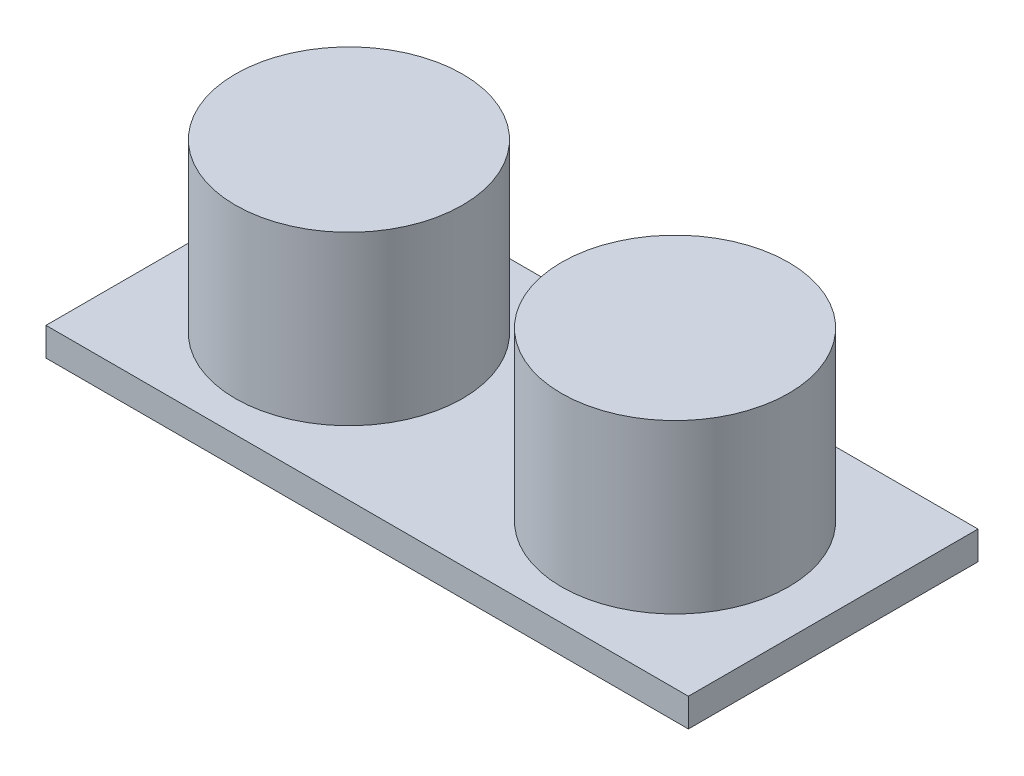
ISO-10303-21;
HEADER;
FILE_DESCRIPTION(('STEP AP214'),'2;1');
FILE_NAME('part.step','',(''),(''),'','','');
FILE_SCHEMA(('AUTOMOTIVE_DESIGN { 1 0 10303 214 1 1 1 1 }'));
ENDSEC;
DATA;
#1=APPLICATION_CONTEXT('core data for automotive mechanical design processes');
#2=APPLICATION_PROTOCOL_DEFINITION('international standard','automotive_design',2000,#1);
#3=PRODUCT_CONTEXT('',#1,'mechanical');
#4=PRODUCT('Part','Part','',(#3));
#5=PRODUCT_RELATED_PRODUCT_CATEGORY('part','',(#4));
#6=PRODUCT_DEFINITION_FORMATION('','',#4);
#7=PRODUCT_DEFINITION_CONTEXT('part definition',#1,'design');
#8=PRODUCT_DEFINITION('design','',#6,#7);
#9=PRODUCT_DEFINITION_SHAPE('','',#8);
#10=(LENGTH_UNIT() NAMED_UNIT(*) SI_UNIT(.MILLI.,.METRE.));
#11=(NAMED_UNIT(*) PLANE_ANGLE_UNIT() SI_UNIT($,.RADIAN.));
#12=(NAMED_UNIT(*) SI_UNIT($,.STERADIAN.) SOLID_ANGLE_UNIT());
#13=UNCERTAINTY_MEASURE_WITH_UNIT(LENGTH_MEASURE(1.E-05),#10,'distance_accuracy_value','');
#14=(GEOMETRIC_REPRESENTATION_CONTEXT(3) GLOBAL_UNCERTAINTY_ASSIGNED_CONTEXT((#13)) GLOBAL_UNIT_ASSIGNED_CONTEXT((#10,
#11,#12)) REPRESENTATION_CONTEXT('',''));
#15=CARTESIAN_POINT('',(0.,0.,0.));
#16=DIRECTION('',(0.,0.,1.));
#17=DIRECTION('',(1.,0.,0.));
#18=AXIS2_PLACEMENT_3D('',#15,#16,#17);
#19=CARTESIAN_POINT('',(-21.3607899807322,2.,-8.06478805394991));
#20=DIRECTION('',(0.,0.,1.));
#21=DIRECTION('',(1.,0.,0.));
#22=AXIS2_PLACEMENT_3D('',#19,#20,#21);
#23=PLANE('',#22);
#24=DIRECTION('',(1.,0.,0.));
#25=VECTOR('',#24,1.);
#26=CARTESIAN_POINT('',(6.48921001926783,-2.3,-8.06478805394991));
#27=LINE('',#26,#25);
#28=CARTESIAN_POINT('',(-3.96078998073218,-2.3,-8.06478805394991));
#29=VERTEX_POINT('',#28);
#30=CARTESIAN_POINT('',(6.48921001926783,-2.3,-8.06478805394991));
#31=VERTEX_POINT('',#30);
#32=EDGE_CURVE('E50',#29,#31,#27,.T.);
#33=ORIENTED_EDGE('',*,*,#32,.F.);
#34=DIRECTION('',(0.,1.,0.));
#35=VECTOR('',#34,1.);
#36=CARTESIAN_POINT('',(-3.96078998073218,-4.3,-8.06478805394991));
#37=LINE('',#36,#35);
#38=CARTESIAN_POINT('',(-3.96078998073218,0.,-8.06478805394991));
#39=VERTEX_POINT('',#38);
#40=EDGE_CURVE('E149',#29,#39,#37,.T.);
#41=ORIENTED_EDGE('',*,*,#40,.T.);
#42=DIRECTION('',(-1.,0.,0.));
#43=VECTOR('',#42,1.);
#44=CARTESIAN_POINT('',(-21.3607899807322,0.,-8.06478805394991));
#45=LINE('',#44,#43);
#46=CARTESIAN_POINT('',(-21.3607899807322,0.,-8.06478805394991));
#47=VERTEX_POINT('',#46);
#48=EDGE_CURVE('E204',#39,#47,#45,.T.);
#49=ORIENTED_EDGE('',*,*,#48,.T.);
#50=DIRECTION('',(0.,-1.,0.));
#51=VECTOR('',#50,1.);
#52=CARTESIAN_POINT('',(-21.3607899807322,2.,-8.06478805394991));
#53=LINE('',#52,#51);
#54=CARTESIAN_POINT('',(-21.3607899807322,2.,-8.06478805394991));
#55=VERTEX_POINT('',#54);
#56=EDGE_CURVE('E197',#55,#47,#53,.T.);
#57=ORIENTED_EDGE('',*,*,#56,.F.);
#58=DIRECTION('',(-1.,0.,0.));
#59=VECTOR('',#58,1.);
#60=CARTESIAN_POINT('',(-21.3607899807322,2.,-8.06478805394991));
#61=LINE('',#60,#59);
#62=CARTESIAN_POINT('',(23.8892100192678,2.,-8.06478805394991));
#63=VERTEX_POINT('',#62);
#64=EDGE_CURVE('E195',#63,#55,#61,.T.);
#65=ORIENTED_EDGE('',*,*,#64,.F.);
#66=DIRECTION('',(0.,-1.,0.));
#67=VECTOR('',#66,1.);
#68=CARTESIAN_POINT('',(23.8892100192678,2.,-8.06478805394991));
#69=LINE('',#68,#67);
#70=CARTESIAN_POINT('',(23.8892100192678,0.,-8.06478805394991));
#71=VERTEX_POINT('',#70);
#72=EDGE_CURVE('E214',#63,#71,#69,.T.);
#73=ORIENTED_EDGE('',*,*,#72,.T.);
#74=CARTESIAN_POINT('',(6.48921001926783,0.,-8.06478805394991));
#75=VERTEX_POINT('',#74);
#76=EDGE_CURVE('E191',#71,#75,#45,.T.);
#77=ORIENTED_EDGE('',*,*,#76,.T.);
#78=DIRECTION('',(0.,1.,0.));
#79=VECTOR('',#78,1.);
#80=CARTESIAN_POINT('',(6.48921001926783,-4.3,-8.06478805394991));
#81=LINE('',#80,#79);
#82=EDGE_CURVE('E165',#31,#75,#81,.T.);
#83=ORIENTED_EDGE('',*,*,#82,.F.);
#84=EDGE_LOOP('',(#33,#41,#49,#57,#65,#73,#77,#83));
#85=FACE_BOUND('',#84,.T.);
#86=ADVANCED_FACE('F33',(#85),#23,.F.);
#87=CARTESIAN_POINT('',(0.,2.,0.));
#88=DIRECTION('',(0.,1.,0.));
#89=DIRECTION('',(0.,0.,1.));
#90=AXIS2_PLACEMENT_3D('',#87,#88,#89);
#91=PLANE('',#90);
#92=CARTESIAN_POINT('',(-10.2220616570328,2.,2.13521194605009));
#93=DIRECTION('',(0.,1.,0.));
#94=DIRECTION('',(0.,0.,1.));
#95=AXIS2_PLACEMENT_3D('',#92,#93,#94);
#96=CIRCLE('',#95,8.);
#97=CARTESIAN_POINT('',(-10.2220616570328,2.,-5.86478805394991));
#98=VERTEX_POINT('',#97);
#99=EDGE_CURVE('E183',#98,#98,#96,.T.);
#100=ORIENTED_EDGE('',*,*,#99,.F.);
#101=EDGE_LOOP('',(#100));
#102=FACE_BOUND('',#101,.T.);
#103=DIRECTION('',(0.,0.,1.));
#104=VECTOR('',#103,1.);
#105=CARTESIAN_POINT('',(-21.3607899807322,2.,-8.06478805394991));
#106=LINE('',#105,#104);
#107=CARTESIAN_POINT('',(-21.3607899807322,2.,12.3352119460501));
#108=VERTEX_POINT('',#107);
#109=EDGE_CURVE('E187',#55,#108,#106,.T.);
#110=ORIENTED_EDGE('',*,*,#109,.T.);
#111=DIRECTION('',(1.,0.,0.));
#112=VECTOR('',#111,1.);
#113=CARTESIAN_POINT('',(-21.3607899807322,2.,12.3352119460501));
#114=LINE('',#113,#112);
#115=CARTESIAN_POINT('',(23.8892100192678,2.,12.3352119460501));
#116=VERTEX_POINT('',#115);
#117=EDGE_CURVE('E190',#108,#116,#114,.T.);
#118=ORIENTED_EDGE('',*,*,#117,.T.);
#119=DIRECTION('',(0.,0.,-1.));
#120=VECTOR('',#119,1.);
#121=CARTESIAN_POINT('',(23.8892100192678,2.,-8.06478805394991));
#122=LINE('',#121,#120);
#123=EDGE_CURVE('E193',#116,#63,#122,.T.);
#124=ORIENTED_EDGE('',*,*,#123,.T.);
#125=ORIENTED_EDGE('',*,*,#64,.T.);
#126=EDGE_LOOP('',(#110,#118,#124,#125));
#127=FACE_BOUND('',#126,.T.);
#128=CARTESIAN_POINT('',(12.7492100192678,2.,2.13521194605009));
#129=DIRECTION('',(0.,1.,0.));
#130=DIRECTION('',(0.,0.,1.));
#131=AXIS2_PLACEMENT_3D('',#128,#129,#130);
#132=CIRCLE('',#131,8.);
#133=CARTESIAN_POINT('',(12.7492100192678,2.,-5.86478805394991));
#134=VERTEX_POINT('',#133);
#135=EDGE_CURVE('E180',#134,#134,#132,.T.);
#136=ORIENTED_EDGE('',*,*,#135,.F.);
#137=EDGE_LOOP('',(#136));
#138=FACE_BOUND('',#137,.T.);
#139=ADVANCED_FACE('F232',(#102,#127,#138),#91,.T.);
#140=CARTESIAN_POINT('',(0.,0.,0.));
#141=DIRECTION('',(0.,1.,0.));
#142=DIRECTION('',(0.,0.,1.));
#143=AXIS2_PLACEMENT_3D('',#140,#141,#142);
#144=PLANE('',#143);
#145=ORIENTED_EDGE('',*,*,#48,.F.);
#146=DIRECTION('',(0.,0.,1.));
#147=VECTOR('',#146,1.);
#148=CARTESIAN_POINT('',(-3.96078998073218,0.,0.));
#149=LINE('',#148,#147);
#150=CARTESIAN_POINT('',(-3.96078998073218,0.,-5.56478805394991));
#151=VERTEX_POINT('',#150);
#152=EDGE_CURVE('E58',#39,#151,#149,.T.);
#153=ORIENTED_EDGE('',*,*,#152,.T.);
#154=DIRECTION('',(-1.,0.,0.));
#155=VECTOR('',#154,1.);
#156=CARTESIAN_POINT('',(0.,0.,-5.56478805394991));
#157=LINE('',#156,#155);
#158=CARTESIAN_POINT('',(6.48921001926783,0.,-5.56478805394991));
#159=VERTEX_POINT('',#158);
#160=EDGE_CURVE('E160',#159,#151,#157,.T.);
#161=ORIENTED_EDGE('',*,*,#160,.F.);
#162=DIRECTION('',(0.,0.,1.));
#163=VECTOR('',#162,1.);
#164=CARTESIAN_POINT('',(6.48921001926783,0.,0.));
#165=LINE('',#164,#163);
#166=EDGE_CURVE('E158',#75,#159,#165,.T.);
#167=ORIENTED_EDGE('',*,*,#166,.F.);
#168=ORIENTED_EDGE('',*,*,#76,.F.);
#169=DIRECTION('',(0.,0.,-1.));
#170=VECTOR('',#169,1.);
#171=CARTESIAN_POINT('',(23.8892100192678,0.,-8.06478805394991));
#172=LINE('',#171,#170);
#173=CARTESIAN_POINT('',(23.8892100192678,0.,12.3352119460501));
#174=VERTEX_POINT('',#173);
#175=EDGE_CURVE('E202',#174,#71,#172,.T.);
#176=ORIENTED_EDGE('',*,*,#175,.F.);
#177=DIRECTION('',(1.,0.,0.));
#178=VECTOR('',#177,1.);
#179=CARTESIAN_POINT('',(-21.3607899807322,0.,12.3352119460501));
#180=LINE('',#179,#178);
#181=CARTESIAN_POINT('',(-21.3607899807322,0.,12.3352119460501));
#182=VERTEX_POINT('',#181);
#183=EDGE_CURVE('E200',#182,#174,#180,.T.);
#184=ORIENTED_EDGE('',*,*,#183,.F.);
#185=DIRECTION('',(0.,0.,1.));
#186=VECTOR('',#185,1.);
#187=CARTESIAN_POINT('',(-21.3607899807322,0.,-8.06478805394991));
#188=LINE('',#187,#186);
#189=EDGE_CURVE('E186',#47,#182,#188,.T.);
#190=ORIENTED_EDGE('',*,*,#189,.F.);
#191=EDGE_LOOP('',(#145,#153,#161,#167,#168,#176,#184,#190));
#192=FACE_BOUND('',#191,.T.);
#193=ADVANCED_FACE('F225',(#192),#144,.F.);
#194=CARTESIAN_POINT('',(-21.3607899807322,2.,-8.06478805394991));
#195=DIRECTION('',(1.,0.,0.));
#196=DIRECTION('',(0.,0.,-1.));
#197=AXIS2_PLACEMENT_3D('',#194,#195,#196);
#198=PLANE('',#197);
#199=ORIENTED_EDGE('',*,*,#189,.T.);
#200=DIRECTION('',(0.,-1.,0.));
#201=VECTOR('',#200,1.);
#202=CARTESIAN_POINT('',(-21.3607899807322,2.,12.3352119460501));
#203=LINE('',#202,#201);
#204=EDGE_CURVE('E11',#108,#182,#203,.T.);
#205=ORIENTED_EDGE('',*,*,#204,.F.);
#206=ORIENTED_EDGE('',*,*,#109,.F.);
#207=ORIENTED_EDGE('',*,*,#56,.T.);
#208=EDGE_LOOP('',(#199,#205,#206,#207));
#209=FACE_BOUND('',#208,.T.);
#210=ADVANCED_FACE('F35',(#209),#198,.F.);
#211=CARTESIAN_POINT('',(-21.3607899807322,2.,12.3352119460501));
#212=DIRECTION('',(0.,0.,-1.));
#213=DIRECTION('',(-1.,0.,0.));
#214=AXIS2_PLACEMENT_3D('',#211,#212,#213);
#215=PLANE('',#214);
#216=ORIENTED_EDGE('',*,*,#183,.T.);
#217=DIRECTION('',(0.,-1.,0.));
#218=VECTOR('',#217,1.);
#219=CARTESIAN_POINT('',(23.8892100192678,2.,12.3352119460501));
#220=LINE('',#219,#218);
#221=EDGE_CURVE('E42',#116,#174,#220,.T.);
#222=ORIENTED_EDGE('',*,*,#221,.F.);
#223=ORIENTED_EDGE('',*,*,#117,.F.);
#224=ORIENTED_EDGE('',*,*,#204,.T.);
#225=EDGE_LOOP('',(#216,#222,#223,#224));
#226=FACE_BOUND('',#225,.T.);
#227=ADVANCED_FACE('F229',(#226),#215,.F.);
#228=CARTESIAN_POINT('',(23.8892100192678,2.,-8.06478805394991));
#229=DIRECTION('',(-1.,0.,0.));
#230=DIRECTION('',(0.,0.,1.));
#231=AXIS2_PLACEMENT_3D('',#228,#229,#230);
#232=PLANE('',#231);
#233=ORIENTED_EDGE('',*,*,#175,.T.);
#234=ORIENTED_EDGE('',*,*,#72,.F.);
#235=ORIENTED_EDGE('',*,*,#123,.F.);
#236=ORIENTED_EDGE('',*,*,#221,.T.);
#237=EDGE_LOOP('',(#233,#234,#235,#236));
#238=FACE_BOUND('',#237,.T.);
#239=ADVANCED_FACE('F243',(#238),#232,.F.);
#240=CARTESIAN_POINT('',(-10.2220616570328,13.8,2.13521194605009));
#241=DIRECTION('',(0.,-1.,0.));
#242=DIRECTION('',(0.,0.,-1.));
#243=AXIS2_PLACEMENT_3D('',#240,#241,#242);
#244=CYLINDRICAL_SURFACE('',#243,8.);
#245=CARTESIAN_POINT('',(-10.2220616570328,13.8,2.13521194605009));
#246=DIRECTION('',(0.,-1.,0.));
#247=DIRECTION('',(0.,0.,-1.));
#248=AXIS2_PLACEMENT_3D('',#245,#246,#247);
#249=CIRCLE('',#248,8.);
#250=CARTESIAN_POINT('',(-10.2220616570328,13.8,-5.86478805394991));
#251=VERTEX_POINT('',#250);
#252=EDGE_CURVE('E177',#251,#251,#249,.T.);
#253=CARTESIAN_POINT('',(-10.2220616570328,2.,-5.86478805394991));
#254=CARTESIAN_POINT('',(-10.2220616570328,2.12291666666667,-5.86478805394991));
#255=CARTESIAN_POINT('',(-10.2220616570328,2.24583333333333,-5.86478805394991));
#256=CARTESIAN_POINT('',(-10.2220616570328,2.49166666666667,-5.86478805394991));
#257=CARTESIAN_POINT('',(-10.2220616570328,2.61458333333333,-5.86478805394991));
#258=CARTESIAN_POINT('',(-10.2220616570328,2.86041666666667,-5.86478805394991));
#259=CARTESIAN_POINT('',(-10.2220616570328,2.98333333333333,-5.86478805394991));
#260=CARTESIAN_POINT('',(-10.2220616570328,3.22916666666666,-5.86478805394991));
#261=CARTESIAN_POINT('',(-10.2220616570328,3.35208333333333,-5.86478805394991));
#262=CARTESIAN_POINT('',(-10.2220616570328,3.59791666666667,-5.86478805394991));
#263=CARTESIAN_POINT('',(-10.2220616570328,3.72083333333333,-5.86478805394991));
#264=CARTESIAN_POINT('',(-10.2220616570328,3.96666666666667,-5.86478805394991));
#265=CARTESIAN_POINT('',(-10.2220616570328,4.08958333333333,-5.86478805394991));
#266=CARTESIAN_POINT('',(-10.2220616570328,4.33541666666667,-5.86478805394991));
#267=CARTESIAN_POINT('',(-10.2220616570328,4.45833333333333,-5.86478805394991));
#268=CARTESIAN_POINT('',(-10.2220616570328,4.70416666666667,-5.86478805394991));
#269=CARTESIAN_POINT('',(-10.2220616570328,4.82708333333333,-5.86478805394991));
#270=CARTESIAN_POINT('',(-10.2220616570328,5.07291666666667,-5.86478805394991));
#271=CARTESIAN_POINT('',(-10.2220616570328,5.19583333333333,-5.86478805394991));
#272=CARTESIAN_POINT('',(-10.2220616570328,5.44166666666667,-5.86478805394991));
#273=CARTESIAN_POINT('',(-10.2220616570328,5.56458333333333,-5.86478805394991));
#274=CARTESIAN_POINT('',(-10.2220616570328,5.81041666666667,-5.86478805394991));
#275=CARTESIAN_POINT('',(-10.2220616570328,5.93333333333333,-5.86478805394991));
#276=CARTESIAN_POINT('',(-10.2220616570328,6.17916666666667,-5.86478805394991));
#277=CARTESIAN_POINT('',(-10.2220616570328,6.30208333333333,-5.86478805394991));
#278=CARTESIAN_POINT('',(-10.2220616570328,6.54791666666667,-5.86478805394991));
#279=CARTESIAN_POINT('',(-10.2220616570328,6.67083333333333,-5.86478805394991));
#280=CARTESIAN_POINT('',(-10.2220616570328,6.91666666666667,-5.86478805394991));
#281=CARTESIAN_POINT('',(-10.2220616570328,7.03958333333333,-5.86478805394991));
#282=CARTESIAN_POINT('',(-10.2220616570328,7.28541666666667,-5.86478805394991));
#283=CARTESIAN_POINT('',(-10.2220616570328,7.40833333333333,-5.86478805394991));
#284=CARTESIAN_POINT('',(-10.2220616570328,7.65416666666667,-5.86478805394991));
#285=CARTESIAN_POINT('',(-10.2220616570328,7.77708333333333,-5.86478805394991));
#286=CARTESIAN_POINT('',(-10.2220616570328,8.02291666666667,-5.86478805394991));
#287=CARTESIAN_POINT('',(-10.2220616570328,8.14583333333333,-5.86478805394991));
#288=CARTESIAN_POINT('',(-10.2220616570328,8.39166666666667,-5.86478805394991));
#289=CARTESIAN_POINT('',(-10.2220616570328,8.51458333333333,-5.86478805394991));
#290=CARTESIAN_POINT('',(-10.2220616570328,8.76041666666667,-5.86478805394991));
#291=CARTESIAN_POINT('',(-10.2220616570328,8.88333333333333,-5.86478805394991));
#292=CARTESIAN_POINT('',(-10.2220616570328,9.12916666666667,-5.86478805394991));
#293=CARTESIAN_POINT('',(-10.2220616570328,9.25208333333333,-5.86478805394991));
#294=CARTESIAN_POINT('',(-10.2220616570328,9.49791666666667,-5.86478805394991));
#295=CARTESIAN_POINT('',(-10.2220616570328,9.62083333333333,-5.86478805394991));
#296=CARTESIAN_POINT('',(-10.2220616570328,9.86666666666667,-5.86478805394991));
#297=CARTESIAN_POINT('',(-10.2220616570328,9.98958333333333,-5.86478805394991));
#298=CARTESIAN_POINT('',(-10.2220616570328,10.2354166666667,-5.86478805394991));
#299=CARTESIAN_POINT('',(-10.2220616570328,10.3583333333333,-5.86478805394991));
#300=CARTESIAN_POINT('',(-10.2220616570328,10.6041666666667,-5.86478805394991));
#301=CARTESIAN_POINT('',(-10.2220616570328,10.7270833333333,-5.86478805394991));
#302=CARTESIAN_POINT('',(-10.2220616570328,10.9729166666667,-5.86478805394991));
#303=CARTESIAN_POINT('',(-10.2220616570328,11.0958333333333,-5.86478805394991));
#304=CARTESIAN_POINT('',(-10.2220616570328,11.3416666666667,-5.86478805394991));
#305=CARTESIAN_POINT('',(-10.2220616570328,11.4645833333333,-5.86478805394991));
#306=CARTESIAN_POINT('',(-10.2220616570328,11.7104166666667,-5.86478805394991));
#307=CARTESIAN_POINT('',(-10.2220616570328,11.8333333333333,-5.86478805394991));
#308=CARTESIAN_POINT('',(-10.2220616570328,12.0791666666667,-5.86478805394991));
#309=CARTESIAN_POINT('',(-10.2220616570328,12.2020833333333,-5.86478805394991));
#310=CARTESIAN_POINT('',(-10.2220616570328,12.4479166666667,-5.86478805394991));
#311=CARTESIAN_POINT('',(-10.2220616570328,12.5708333333333,-5.86478805394991));
#312=CARTESIAN_POINT('',(-10.2220616570328,12.8166666666667,-5.86478805394991));
#313=CARTESIAN_POINT('',(-10.2220616570328,12.9395833333333,-5.86478805394991));
#314=CARTESIAN_POINT('',(-10.2220616570328,13.1854166666667,-5.86478805394991));
#315=CARTESIAN_POINT('',(-10.2220616570328,13.3083333333333,-5.86478805394991));
#316=CARTESIAN_POINT('',(-10.2220616570328,13.5541666666667,-5.86478805394991));
#317=CARTESIAN_POINT('',(-10.2220616570328,13.6770833333333,-5.86478805394991));
#318=CARTESIAN_POINT('',(-10.2220616570328,13.8,-5.86478805394991));
#319=B_SPLINE_CURVE_WITH_KNOTS('',3,(#253,#254,#255,#256,#257,#258,#259,#260,#261,#262,#263,
#264,#265,#266,#267,#268,#269,#270,#271,#272,#273,#274,#275,#276,#277,#278,#279,#280,#281,#282,
#283,#284,#285,#286,#287,#288,#289,#290,#291,#292,#293,#294,#295,#296,#297,#298,#299,#300,#301,
#302,#303,#304,#305,#306,#307,#308,#309,#310,#311,#312,#313,#314,#315,#316,#317,#318),
.UNSPECIFIED.,.F.,.F.,(4,2,2,2,2,2,2,2,2,2,2,2,2,2,2,2,2,2,2,2,2,2,2,2,2,2,2,2,2,2,2,2,4),(0.,
0.368750000000001,0.7375,1.10625,1.475,1.84375,2.2125,2.58125,2.95,3.31875,3.6875,4.05625,4.425,
4.79375,5.1625,5.53125,5.9,6.26875,6.6375,7.00625,7.375,7.74375,8.1125,8.48125,8.85,9.21875,
9.5875,9.95625,10.325,10.69375,11.0625,11.43125,11.8),.UNSPECIFIED.);
#320=EDGE_CURVE('BSEAM245',#98,#251,#319,.T.);
#321=ORIENTED_EDGE('',*,*,#99,.T.);
#322=ORIENTED_EDGE('',*,*,#252,.T.);
#323=ORIENTED_EDGE('',*,*,#320,.T.);
#324=ORIENTED_EDGE('',*,*,#320,.F.);
#325=EDGE_LOOP('',(#321,#323,#322,#324));
#326=FACE_BOUND('',#325,.T.);
#327=ADVANCED_FACE('F245',(#326),#244,.T.);
#328=CARTESIAN_POINT('',(-10.2220616570328,13.8,2.13521194605009));
#329=DIRECTION('',(0.,-1.,0.));
#330=DIRECTION('',(0.,0.,-1.));
#331=AXIS2_PLACEMENT_3D('',#328,#329,#330);
#332=PLANE('',#331);
#333=ORIENTED_EDGE('',*,*,#252,.F.);
#334=EDGE_LOOP('',(#333));
#335=FACE_BOUND('',#334,.T.);
#336=ADVANCED_FACE('F287',(#335),#332,.F.);
#337=CARTESIAN_POINT('',(12.7492100192678,13.8,2.13521194605009));
#338=DIRECTION('',(0.,-1.,0.));
#339=DIRECTION('',(0.,0.,-1.));
#340=AXIS2_PLACEMENT_3D('',#337,#338,#339);
#341=CYLINDRICAL_SURFACE('',#340,8.);
#342=CARTESIAN_POINT('',(12.7492100192678,13.8,2.13521194605009));
#343=DIRECTION('',(0.,-1.,0.));
#344=DIRECTION('',(0.,0.,-1.));
#345=AXIS2_PLACEMENT_3D('',#342,#343,#344);
#346=CIRCLE('',#345,8.);
#347=CARTESIAN_POINT('',(12.7492100192678,13.8,-5.86478805394991));
#348=VERTEX_POINT('',#347);
#349=EDGE_CURVE('E174',#348,#348,#346,.T.);
#350=CARTESIAN_POINT('',(12.7492100192678,2.,-5.86478805394991));
#351=CARTESIAN_POINT('',(12.7492100192678,2.12291666666667,-5.86478805394991));
#352=CARTESIAN_POINT('',(12.7492100192678,2.24583333333333,-5.86478805394991));
#353=CARTESIAN_POINT('',(12.7492100192678,2.49166666666667,-5.86478805394991));
#354=CARTESIAN_POINT('',(12.7492100192678,2.61458333333333,-5.86478805394991));
#355=CARTESIAN_POINT('',(12.7492100192678,2.86041666666667,-5.86478805394991));
#356=CARTESIAN_POINT('',(12.7492100192678,2.98333333333333,-5.86478805394991));
#357=CARTESIAN_POINT('',(12.7492100192678,3.22916666666666,-5.86478805394991));
#358=CARTESIAN_POINT('',(12.7492100192678,3.35208333333333,-5.86478805394991));
#359=CARTESIAN_POINT('',(12.7492100192678,3.59791666666667,-5.86478805394991));
#360=CARTESIAN_POINT('',(12.7492100192678,3.72083333333333,-5.86478805394991));
#361=CARTESIAN_POINT('',(12.7492100192678,3.96666666666667,-5.86478805394991));
#362=CARTESIAN_POINT('',(12.7492100192678,4.08958333333333,-5.86478805394991));
#363=CARTESIAN_POINT('',(12.7492100192678,4.33541666666667,-5.86478805394991));
#364=CARTESIAN_POINT('',(12.7492100192678,4.45833333333333,-5.86478805394991));
#365=CARTESIAN_POINT('',(12.7492100192678,4.70416666666667,-5.86478805394991));
#366=CARTESIAN_POINT('',(12.7492100192678,4.82708333333333,-5.86478805394991));
#367=CARTESIAN_POINT('',(12.7492100192678,5.07291666666667,-5.86478805394991));
#368=CARTESIAN_POINT('',(12.7492100192678,5.19583333333333,-5.86478805394991));
#369=CARTESIAN_POINT('',(12.7492100192678,5.44166666666667,-5.86478805394991));
#370=CARTESIAN_POINT('',(12.7492100192678,5.56458333333333,-5.86478805394991));
#371=CARTESIAN_POINT('',(12.7492100192678,5.81041666666667,-5.86478805394991));
#372=CARTESIAN_POINT('',(12.7492100192678,5.93333333333333,-5.86478805394991));
#373=CARTESIAN_POINT('',(12.7492100192678,6.17916666666667,-5.86478805394991));
#374=CARTESIAN_POINT('',(12.7492100192678,6.30208333333333,-5.86478805394991));
#375=CARTESIAN_POINT('',(12.7492100192678,6.54791666666667,-5.86478805394991));
#376=CARTESIAN_POINT('',(12.7492100192678,6.67083333333333,-5.86478805394991));
#377=CARTESIAN_POINT('',(12.7492100192678,6.91666666666667,-5.86478805394991));
#378=CARTESIAN_POINT('',(12.7492100192678,7.03958333333333,-5.86478805394991));
#379=CARTESIAN_POINT('',(12.7492100192678,7.28541666666667,-5.86478805394991));
#380=CARTESIAN_POINT('',(12.7492100192678,7.40833333333333,-5.86478805394991));
#381=CARTESIAN_POINT('',(12.7492100192678,7.65416666666667,-5.86478805394991));
#382=CARTESIAN_POINT('',(12.7492100192678,7.77708333333333,-5.86478805394991));
#383=CARTESIAN_POINT('',(12.7492100192678,8.02291666666667,-5.86478805394991));
#384=CARTESIAN_POINT('',(12.7492100192678,8.14583333333333,-5.86478805394991));
#385=CARTESIAN_POINT('',(12.7492100192678,8.39166666666667,-5.86478805394991));
#386=CARTESIAN_POINT('',(12.7492100192678,8.51458333333333,-5.86478805394991));
#387=CARTESIAN_POINT('',(12.7492100192678,8.76041666666667,-5.86478805394991));
#388=CARTESIAN_POINT('',(12.7492100192678,8.88333333333333,-5.86478805394991));
#389=CARTESIAN_POINT('',(12.7492100192678,9.12916666666667,-5.86478805394991));
#390=CARTESIAN_POINT('',(12.7492100192678,9.25208333333333,-5.86478805394991));
#391=CARTESIAN_POINT('',(12.7492100192678,9.49791666666667,-5.86478805394991));
#392=CARTESIAN_POINT('',(12.7492100192678,9.62083333333333,-5.86478805394991));
#393=CARTESIAN_POINT('',(12.7492100192678,9.86666666666667,-5.86478805394991));
#394=CARTESIAN_POINT('',(12.7492100192678,9.98958333333333,-5.86478805394991));
#395=CARTESIAN_POINT('',(12.7492100192678,10.2354166666667,-5.86478805394991));
#396=CARTESIAN_POINT('',(12.7492100192678,10.3583333333333,-5.86478805394991));
#397=CARTESIAN_POINT('',(12.7492100192678,10.6041666666667,-5.86478805394991));
#398=CARTESIAN_POINT('',(12.7492100192678,10.7270833333333,-5.86478805394991));
#399=CARTESIAN_POINT('',(12.7492100192678,10.9729166666667,-5.86478805394991));
#400=CARTESIAN_POINT('',(12.7492100192678,11.0958333333333,-5.86478805394991));
#401=CARTESIAN_POINT('',(12.7492100192678,11.3416666666667,-5.86478805394991));
#402=CARTESIAN_POINT('',(12.7492100192678,11.4645833333333,-5.86478805394991));
#403=CARTESIAN_POINT('',(12.7492100192678,11.7104166666667,-5.86478805394991));
#404=CARTESIAN_POINT('',(12.7492100192678,11.8333333333333,-5.86478805394991));
#405=CARTESIAN_POINT('',(12.7492100192678,12.0791666666667,-5.86478805394991));
#406=CARTESIAN_POINT('',(12.7492100192678,12.2020833333333,-5.86478805394991));
#407=CARTESIAN_POINT('',(12.7492100192678,12.4479166666667,-5.86478805394991));
#408=CARTESIAN_POINT('',(12.7492100192678,12.5708333333333,-5.86478805394991));
#409=CARTESIAN_POINT('',(12.7492100192678,12.8166666666667,-5.86478805394991));
#410=CARTESIAN_POINT('',(12.7492100192678,12.9395833333333,-5.86478805394991));
#411=CARTESIAN_POINT('',(12.7492100192678,13.1854166666667,-5.86478805394991));
#412=CARTESIAN_POINT('',(12.7492100192678,13.3083333333333,-5.86478805394991));
#413=CARTESIAN_POINT('',(12.7492100192678,13.5541666666667,-5.86478805394991));
#414=CARTESIAN_POINT('',(12.7492100192678,13.6770833333333,-5.86478805394991));
#415=CARTESIAN_POINT('',(12.7492100192678,13.8,-5.86478805394991));
#416=B_SPLINE_CURVE_WITH_KNOTS('',3,(#350,#351,#352,#353,#354,#355,#356,#357,#358,#359,#360,
#361,#362,#363,#364,#365,#366,#367,#368,#369,#370,#371,#372,#373,#374,#375,#376,#377,#378,#379,
#380,#381,#382,#383,#384,#385,#386,#387,#388,#389,#390,#391,#392,#393,#394,#395,#396,#397,#398,
#399,#400,#401,#402,#403,#404,#405,#406,#407,#408,#409,#410,#411,#412,#413,#414,#415),
.UNSPECIFIED.,.F.,.F.,(4,2,2,2,2,2,2,2,2,2,2,2,2,2,2,2,2,2,2,2,2,2,2,2,2,2,2,2,2,2,2,2,4),(0.,
0.368750000000001,0.7375,1.10625,1.475,1.84375,2.2125,2.58125,2.95,3.31875,3.6875,4.05625,4.425,
4.79375,5.1625,5.53125,5.9,6.26875,6.6375,7.00625,7.375,7.74375,8.1125,8.48125,8.85,9.21875,
9.5875,9.95625,10.325,10.69375,11.0625,11.43125,11.8),.UNSPECIFIED.);
#417=EDGE_CURVE('BSEAM297',#134,#348,#416,.T.);
#418=ORIENTED_EDGE('',*,*,#135,.T.);
#419=ORIENTED_EDGE('',*,*,#349,.T.);
#420=ORIENTED_EDGE('',*,*,#417,.T.);
#421=ORIENTED_EDGE('',*,*,#417,.F.);
#422=EDGE_LOOP('',(#418,#420,#419,#421));
#423=FACE_BOUND('',#422,.T.);
#424=ADVANCED_FACE('F297',(#423),#341,.T.);
#425=CARTESIAN_POINT('',(12.7492100192678,13.8,2.13521194605009));
#426=DIRECTION('',(0.,-1.,0.));
#427=DIRECTION('',(0.,0.,-1.));
#428=AXIS2_PLACEMENT_3D('',#425,#426,#427);
#429=PLANE('',#428);
#430=ORIENTED_EDGE('',*,*,#349,.F.);
#431=EDGE_LOOP('',(#430));
#432=FACE_BOUND('',#431,.T.);
#433=ADVANCED_FACE('F306',(#432),#429,.F.);
#434=CARTESIAN_POINT('',(-3.96078998073218,-4.3,0.));
#435=DIRECTION('',(-1.,0.,0.));
#436=DIRECTION('',(0.,0.,1.));
#437=AXIS2_PLACEMENT_3D('',#434,#435,#436);
#438=PLANE('',#437);
#439=ORIENTED_EDGE('',*,*,#152,.F.);
#440=ORIENTED_EDGE('',*,*,#40,.F.);
#441=DIRECTION('',(0.,0.,1.));
#442=VECTOR('',#441,1.);
#443=CARTESIAN_POINT('',(-3.96078998073218,-2.3,-14.4647880539499));
#444=LINE('',#443,#442);
#445=CARTESIAN_POINT('',(-3.96078998073218,-2.3,-14.4647880539499));
#446=VERTEX_POINT('',#445);
#447=EDGE_CURVE('E153',#446,#29,#444,.T.);
#448=ORIENTED_EDGE('',*,*,#447,.F.);
#449=DIRECTION('',(0.,1.,0.));
#450=VECTOR('',#449,1.);
#451=CARTESIAN_POINT('',(-3.96078998073218,-4.3,-14.4647880539499));
#452=LINE('',#451,#450);
#453=CARTESIAN_POINT('',(-3.96078998073218,-4.3,-14.4647880539499));
#454=VERTEX_POINT('',#453);
#455=EDGE_CURVE('E133',#454,#446,#452,.T.);
#456=ORIENTED_EDGE('',*,*,#455,.F.);
#457=DIRECTION('',(0.,0.,1.));
#458=VECTOR('',#457,1.);
#459=CARTESIAN_POINT('',(-3.96078998073218,-4.3,0.));
#460=LINE('',#459,#458);
#461=CARTESIAN_POINT('',(-3.96078998073218,-4.3,-5.56478805394991));
#462=VERTEX_POINT('',#461);
#463=EDGE_CURVE('E125',#454,#462,#460,.T.);
#464=ORIENTED_EDGE('',*,*,#463,.T.);
#465=DIRECTION('',(0.,1.,0.));
#466=VECTOR('',#465,1.);
#467=CARTESIAN_POINT('',(-3.96078998073218,-4.3,-5.56478805394991));
#468=LINE('',#467,#466);
#469=EDGE_CURVE('E171',#462,#151,#468,.T.);
#470=ORIENTED_EDGE('',*,*,#469,.T.);
#471=EDGE_LOOP('',(#439,#440,#448,#456,#464,#470));
#472=FACE_BOUND('',#471,.T.);
#473=ADVANCED_FACE('F315',(#472),#438,.T.);
#474=CARTESIAN_POINT('',(6.48921001926783,-4.3,0.));
#475=DIRECTION('',(-1.,0.,0.));
#476=DIRECTION('',(0.,0.,1.));
#477=AXIS2_PLACEMENT_3D('',#474,#475,#476);
#478=PLANE('',#477);
#479=ORIENTED_EDGE('',*,*,#166,.T.);
#480=DIRECTION('',(0.,1.,0.));
#481=VECTOR('',#480,1.);
#482=CARTESIAN_POINT('',(6.48921001926783,-4.3,-5.56478805394991));
#483=LINE('',#482,#481);
#484=CARTESIAN_POINT('',(6.48921001926783,-4.3,-5.56478805394991));
#485=VERTEX_POINT('',#484);
#486=EDGE_CURVE('E121',#485,#159,#483,.T.);
#487=ORIENTED_EDGE('',*,*,#486,.F.);
#488=DIRECTION('',(0.,0.,1.));
#489=VECTOR('',#488,1.);
#490=CARTESIAN_POINT('',(6.48921001926783,-4.3,0.));
#491=LINE('',#490,#489);
#492=CARTESIAN_POINT('',(6.48921001926783,-4.3,-14.4647880539499));
#493=VERTEX_POINT('',#492);
#494=EDGE_CURVE('E113',#493,#485,#491,.T.);
#495=ORIENTED_EDGE('',*,*,#494,.F.);
#496=DIRECTION('',(0.,-1.,0.));
#497=VECTOR('',#496,1.);
#498=CARTESIAN_POINT('',(6.48921001926783,-4.3,-14.4647880539499));
#499=LINE('',#498,#497);
#500=CARTESIAN_POINT('',(6.48921001926783,-2.3,-14.4647880539499));
#501=VERTEX_POINT('',#500);
#502=EDGE_CURVE('E119',#501,#493,#499,.T.);
#503=ORIENTED_EDGE('',*,*,#502,.F.);
#504=DIRECTION('',(0.,0.,1.));
#505=VECTOR('',#504,1.);
#506=CARTESIAN_POINT('',(6.48921001926783,-2.3,-14.4647880539499));
#507=LINE('',#506,#505);
#508=EDGE_CURVE('E144',#501,#31,#507,.T.);
#509=ORIENTED_EDGE('',*,*,#508,.T.);
#510=ORIENTED_EDGE('',*,*,#82,.T.);
#511=EDGE_LOOP('',(#479,#487,#495,#503,#509,#510));
#512=FACE_BOUND('',#511,.T.);
#513=ADVANCED_FACE('F116',(#512),#478,.F.);
#514=CARTESIAN_POINT('',(0.,-4.3,-5.56478805394991));
#515=DIRECTION('',(0.,0.,-1.));
#516=DIRECTION('',(-1.,0.,0.));
#517=AXIS2_PLACEMENT_3D('',#514,#515,#516);
#518=PLANE('',#517);
#519=ORIENTED_EDGE('',*,*,#160,.T.);
#520=ORIENTED_EDGE('',*,*,#469,.F.);
#521=DIRECTION('',(-1.,0.,0.));
#522=VECTOR('',#521,1.);
#523=CARTESIAN_POINT('',(0.,-4.3,-5.56478805394991));
#524=LINE('',#523,#522);
#525=EDGE_CURVE('E124',#485,#462,#524,.T.);
#526=ORIENTED_EDGE('',*,*,#525,.F.);
#527=ORIENTED_EDGE('',*,*,#486,.T.);
#528=EDGE_LOOP('',(#519,#520,#526,#527));
#529=FACE_BOUND('',#528,.T.);
#530=ADVANCED_FACE('F333',(#529),#518,.F.);
#531=CARTESIAN_POINT('',(0.,-4.3,0.));
#532=DIRECTION('',(0.,-1.,0.));
#533=DIRECTION('',(0.,0.,-1.));
#534=AXIS2_PLACEMENT_3D('',#531,#532,#533);
#535=PLANE('',#534);
#536=ORIENTED_EDGE('',*,*,#463,.F.);
#537=DIRECTION('',(-1.,0.,0.));
#538=VECTOR('',#537,1.);
#539=CARTESIAN_POINT('',(6.48921001926783,-4.3,-14.4647880539499));
#540=LINE('',#539,#538);
#541=EDGE_CURVE('E128',#493,#454,#540,.T.);
#542=ORIENTED_EDGE('',*,*,#541,.F.);
#543=ORIENTED_EDGE('',*,*,#494,.T.);
#544=ORIENTED_EDGE('',*,*,#525,.T.);
#545=EDGE_LOOP('',(#536,#542,#543,#544));
#546=FACE_BOUND('',#545,.T.);
#547=ADVANCED_FACE('F129',(#546),#535,.T.);
#548=CARTESIAN_POINT('',(6.48921001926783,-2.3,-14.4647880539499));
#549=DIRECTION('',(0.,-1.,0.));
#550=DIRECTION('',(0.,0.,-1.));
#551=AXIS2_PLACEMENT_3D('',#548,#549,#550);
#552=PLANE('',#551);
#553=ORIENTED_EDGE('',*,*,#32,.T.);
#554=ORIENTED_EDGE('',*,*,#508,.F.);
#555=DIRECTION('',(1.,0.,0.));
#556=VECTOR('',#555,1.);
#557=CARTESIAN_POINT('',(6.48921001926783,-2.3,-14.4647880539499));
#558=LINE('',#557,#556);
#559=EDGE_CURVE('E137',#446,#501,#558,.T.);
#560=ORIENTED_EDGE('',*,*,#559,.F.);
#561=ORIENTED_EDGE('',*,*,#447,.T.);
#562=EDGE_LOOP('',(#553,#554,#560,#561));
#563=FACE_BOUND('',#562,.T.);
#564=ADVANCED_FACE('F346',(#563),#552,.F.);
#565=CARTESIAN_POINT('',(0.,0.,-14.4647880539499));
#566=DIRECTION('',(0.,0.,1.));
#567=DIRECTION('',(1.,0.,0.));
#568=AXIS2_PLACEMENT_3D('',#565,#566,#567);
#569=PLANE('',#568);
#570=ORIENTED_EDGE('',*,*,#502,.T.);
#571=ORIENTED_EDGE('',*,*,#541,.T.);
#572=ORIENTED_EDGE('',*,*,#455,.T.);
#573=ORIENTED_EDGE('',*,*,#559,.T.);
#574=EDGE_LOOP('',(#570,#571,#572,#573));
#575=FACE_BOUND('',#574,.T.);
#576=ADVANCED_FACE('F135',(#575),#569,.F.);
#577=CLOSED_SHELL('',(#86,#139,#193,#210,#227,#239,#327,#336,#424,#433,#473,#513,#530,#547,#564,#576));
#578=MANIFOLD_SOLID_BREP('B2',#577);
#579=ADVANCED_BREP_SHAPE_REPRESENTATION('',(#18,#578),#14);
#580=SHAPE_DEFINITION_REPRESENTATION(#9,#579);
ENDSEC;
END-ISO-10303-21;
